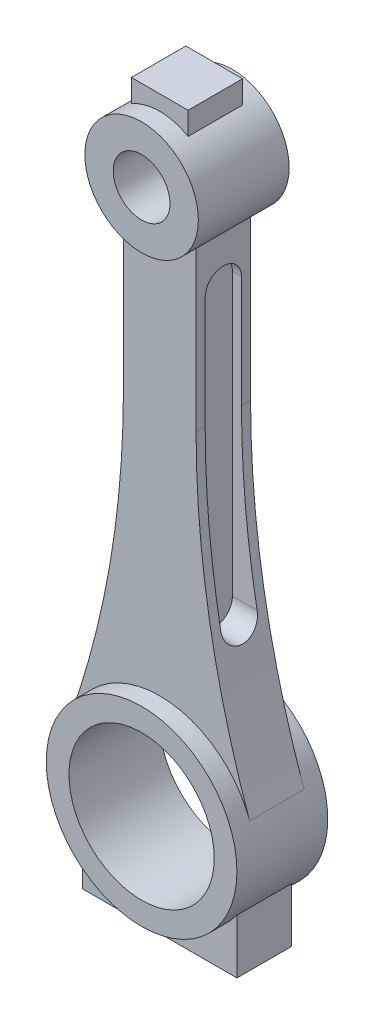
ISO-10303-21;
HEADER;
FILE_DESCRIPTION(('STEP AP214'),'2;1');
FILE_NAME('part.step','',(''),(''),'','','');
FILE_SCHEMA(('AUTOMOTIVE_DESIGN { 1 0 10303 214 1 1 1 1 }'));
ENDSEC;
DATA;
#1=APPLICATION_CONTEXT('core data for automotive mechanical design processes');
#2=APPLICATION_PROTOCOL_DEFINITION('international standard','automotive_design',2000,#1);
#3=PRODUCT_CONTEXT('',#1,'mechanical');
#4=PRODUCT('Part','Part','',(#3));
#5=PRODUCT_RELATED_PRODUCT_CATEGORY('part','',(#4));
#6=PRODUCT_DEFINITION_FORMATION('','',#4);
#7=PRODUCT_DEFINITION_CONTEXT('part definition',#1,'design');
#8=PRODUCT_DEFINITION('design','',#6,#7);
#9=PRODUCT_DEFINITION_SHAPE('','',#8);
#10=(LENGTH_UNIT() NAMED_UNIT(*) SI_UNIT(.MILLI.,.METRE.));
#11=(NAMED_UNIT(*) PLANE_ANGLE_UNIT() SI_UNIT($,.RADIAN.));
#12=(NAMED_UNIT(*) SI_UNIT($,.STERADIAN.) SOLID_ANGLE_UNIT());
#13=UNCERTAINTY_MEASURE_WITH_UNIT(LENGTH_MEASURE(1.E-05),#10,'distance_accuracy_value','');
#14=(GEOMETRIC_REPRESENTATION_CONTEXT(3) GLOBAL_UNCERTAINTY_ASSIGNED_CONTEXT((#13)) GLOBAL_UNIT_ASSIGNED_CONTEXT((#10,
#11,#12)) REPRESENTATION_CONTEXT('',''));
#15=CARTESIAN_POINT('',(0.,0.,0.));
#16=DIRECTION('',(0.,0.,1.));
#17=DIRECTION('',(1.,0.,0.));
#18=AXIS2_PLACEMENT_3D('',#15,#16,#17);
#19=CARTESIAN_POINT('',(212.132819979024,75.3953136438508,6.));
#20=DIRECTION('',(0.,0.,-1.));
#21=DIRECTION('',(-1.,0.,0.));
#22=AXIS2_PLACEMENT_3D('',#19,#20,#21);
#23=CYLINDRICAL_SURFACE('',#22,204.132819979024);
#24=CARTESIAN_POINT('',(11.4544735884215,38.,-4.00000000000001));
#25=CARTESIAN_POINT('',(11.4757515518411,37.885808633556,-4.00000967356236));
#26=CARTESIAN_POINT('',(11.4971278489319,37.7716411229783,-3.9951101211208));
#27=CARTESIAN_POINT('',(11.5399210356049,37.544152772884,-3.97557755361704));
#28=CARTESIAN_POINT('',(11.5613379239584,37.4308319082382,-3.9609448286138));
#29=CARTESIAN_POINT('',(11.6040518019029,37.2058589467753,-3.92203609087538));
#30=CARTESIAN_POINT('',(11.6253488219802,37.0942064124742,-3.89776265395078));
#31=CARTESIAN_POINT('',(11.6676599337569,36.8733657612217,-3.83975872762631));
#32=CARTESIAN_POINT('',(11.6886740293759,36.7641776101132,-3.80602836938937));
#33=CARTESIAN_POINT('',(11.7510730473326,36.4413470108117,-3.69089420326938));
#34=CARTESIAN_POINT('',(11.7918289081029,36.2323636826891,-3.59553432969808));
#35=CARTESIAN_POINT('',(11.8702126062763,35.833491871712,-3.37027556179514));
#36=CARTESIAN_POINT('',(11.9078413597511,35.643597793309,-3.24038682968163));
#37=CARTESIAN_POINT('',(11.9784728244352,35.2894796680367,-2.950436910244));
#38=CARTESIAN_POINT('',(12.0115036519544,35.1250988255321,-2.79057453802655));
#39=CARTESIAN_POINT('',(12.0720036427705,34.8256035029567,-2.44449926104124));
#40=CARTESIAN_POINT('',(12.0994724370193,34.6904909648341,-2.25828460915734));
#41=CARTESIAN_POINT('',(12.1473413477104,34.4559602912754,-1.86832249559897));
#42=CARTESIAN_POINT('',(12.1678582991115,34.3559510460777,-1.66494499104501));
#43=CARTESIAN_POINT('',(12.201667760202,34.1915558050774,-1.24372237948288));
#44=CARTESIAN_POINT('',(12.2149615713728,34.1271633917176,-1.02587988675161));
#45=CARTESIAN_POINT('',(12.2336033492388,34.0369591960168,-0.586274812122711));
#46=CARTESIAN_POINT('',(12.2390950212482,34.0104496060439,-0.36466133556186));
#47=CARTESIAN_POINT('',(12.2423732155318,33.9946184843633,0.0799443502249366));
#48=CARTESIAN_POINT('',(12.2401601145853,34.0052951341723,0.302936491499029));
#49=CARTESIAN_POINT('',(12.2281765408432,34.0632127244266,0.74178192582431));
#50=CARTESIAN_POINT('',(12.2184766498272,34.1101121767817,0.957682365575699));
#51=CARTESIAN_POINT('',(12.1919895794175,34.2385791029979,1.37844153266758));
#52=CARTESIAN_POINT('',(12.1752023313576,34.3201469127454,1.58330015300714));
#53=CARTESIAN_POINT('',(12.1350793834177,34.5159552856904,1.977397761575));
#54=CARTESIAN_POINT('',(12.1117098081663,34.6303649264095,2.16654921549122));
#55=CARTESIAN_POINT('',(12.0593260749272,34.8882465100265,2.52297125984127));
#56=CARTESIAN_POINT('',(12.0303117725959,35.0317191961119,2.69024129055298));
#57=CARTESIAN_POINT('',(11.9671383735568,35.3461665633751,3.00114206510913));
#58=CARTESIAN_POINT('',(11.9329025496515,35.5175545383741,3.14433904981938));
#59=CARTESIAN_POINT('',(11.8607975408037,35.8812712267655,3.40006280722764));
#60=CARTESIAN_POINT('',(11.8229268395297,36.0736086840292,3.51257670427655));
#61=CARTESIAN_POINT('',(11.744011046999,36.4777513253325,3.70593438635491));
#62=CARTESIAN_POINT('',(11.7029182624971,36.6898643551292,3.78611370956407));
#63=CARTESIAN_POINT('',(11.6195357198389,37.1241795414682,3.90944320644274));
#64=CARTESIAN_POINT('',(11.5772477716992,37.3463667203578,3.95264656840454));
#65=CARTESIAN_POINT('',(11.5215540274852,37.6417241762258,3.98457340087694));
#66=CARTESIAN_POINT('',(11.5080944382149,37.7133147532121,3.99036111817268));
#67=CARTESIAN_POINT('',(11.4812368188341,37.8565916807734,3.99806924003837));
#68=CARTESIAN_POINT('',(11.467838723541,37.9282776734255,3.99999606757804));
#69=CARTESIAN_POINT('',(11.4544735884214,38.,3.99999999999999));
#70=B_SPLINE_CURVE_WITH_KNOTS('',3,(#24,#25,#26,#27,#28,#29,#30,#31,#32,#33,#34,#35,#36,#37,#38,
#39,#40,#41,#42,#43,#44,#45,#46,#47,#48,#49,#50,#51,#52,#53,#54,#55,#56,#57,#58,#59,#60,#61,#62,
#63,#64,#65,#66,#67,#68,#69),.UNSPECIFIED.,.F.,.F.,(4,2,2,2,2,2,2,2,2,2,2,2,2,2,2,2,2,2,2,2,2,2,
4),(0.,0.348357600629768,0.696704820295746,1.044959030908,1.39320841164154,2.0894785742732,
2.78554404346983,3.47714614167072,4.16879411353829,4.84816302804555,5.52740949173435,
6.19397531687088,6.86050854603355,7.52083364695974,8.18116514562693,8.84495910470897,
9.508770040179,10.1834922182609,10.8584970981523,11.546741507572,12.2339942357505,
12.4531452672714,12.6719314158043),.UNSPECIFIED.);
#71=CARTESIAN_POINT('',(11.4544735884215,38.,-4.00000000000001));
#72=VERTEX_POINT('',#71);
#73=CARTESIAN_POINT('',(11.4544735884215,38.,3.99999999999999));
#74=VERTEX_POINT('',#73);
#75=EDGE_CURVE('E401',#72,#74,#70,.T.);
#76=ORIENTED_EDGE('',*,*,#75,.T.);
#77=CARTESIAN_POINT('',(212.132819979024,75.3953136438508,3.99999999999999));
#78=DIRECTION('',(0.,0.,-1.));
#79=DIRECTION('',(0.,1.,0.));
#80=AXIS2_PLACEMENT_3D('',#77,#78,#79);
#81=CIRCLE('',#80,204.132819979024);
#82=CARTESIAN_POINT('',(8.00000000000001,75.3953136438507,4.));
#83=VERTEX_POINT('',#82);
#84=EDGE_CURVE('E253',#74,#83,#81,.T.);
#85=ORIENTED_EDGE('',*,*,#84,.T.);
#86=DIRECTION('',(0.,0.,-1.));
#87=VECTOR('',#86,1.);
#88=CARTESIAN_POINT('',(8.00000000000001,75.3953136438507,6.));
#89=LINE('',#88,#87);
#90=CARTESIAN_POINT('',(8.00000000000001,75.3953136438507,6.));
#91=VERTEX_POINT('',#90);
#92=EDGE_CURVE('E377',#91,#83,#89,.T.);
#93=ORIENTED_EDGE('',*,*,#92,.F.);
#94=CARTESIAN_POINT('',(212.132819979024,75.3953136438508,6.));
#95=DIRECTION('',(0.,0.,1.));
#96=DIRECTION('',(1.,0.,0.));
#97=AXIS2_PLACEMENT_3D('',#94,#95,#96);
#98=CIRCLE('',#97,204.132819979024);
#99=CARTESIAN_POINT('',(19.7873824881444,7.03274443356763,6.));
#100=VERTEX_POINT('',#99);
#101=EDGE_CURVE('E334',#91,#100,#98,.T.);
#102=ORIENTED_EDGE('',*,*,#101,.T.);
#103=DIRECTION('',(0.,0.,-1.));
#104=VECTOR('',#103,1.);
#105=CARTESIAN_POINT('',(19.7873824881444,7.03274443356765,6.));
#106=LINE('',#105,#104);
#107=CARTESIAN_POINT('',(19.7873824881444,7.03274443356765,-6.));
#108=VERTEX_POINT('',#107);
#109=EDGE_CURVE('E380',#100,#108,#106,.T.);
#110=ORIENTED_EDGE('',*,*,#109,.T.);
#111=CARTESIAN_POINT('',(212.132819979024,75.3953136438508,-6.));
#112=DIRECTION('',(0.,0.,1.));
#113=DIRECTION('',(1.,0.,0.));
#114=AXIS2_PLACEMENT_3D('',#111,#112,#113);
#115=CIRCLE('',#114,204.132819979024);
#116=CARTESIAN_POINT('',(8.00000000000001,75.3953136438507,-6.));
#117=VERTEX_POINT('',#116);
#118=EDGE_CURVE('E352',#117,#108,#115,.T.);
#119=ORIENTED_EDGE('',*,*,#118,.F.);
#120=CARTESIAN_POINT('',(8.00000000000001,75.3953136438507,-4.));
#121=VERTEX_POINT('',#120);
#122=EDGE_CURVE('E376',#121,#117,#89,.T.);
#123=ORIENTED_EDGE('',*,*,#122,.F.);
#124=CARTESIAN_POINT('',(212.132819979024,75.3953136438508,-4.00000000000001));
#125=DIRECTION('',(0.,0.,1.));
#126=DIRECTION('',(0.,-1.,0.));
#127=AXIS2_PLACEMENT_3D('',#124,#125,#126);
#128=CIRCLE('',#127,204.132819979024);
#129=EDGE_CURVE('E59',#121,#72,#128,.T.);
#130=ORIENTED_EDGE('',*,*,#129,.T.);
#131=EDGE_LOOP('',(#76,#85,#93,#102,#110,#119,#123,#130));
#132=FACE_BOUND('',#131,.T.);
#133=ADVANCED_FACE('F36',(#132),#23,.F.);
#134=CARTESIAN_POINT('',(8.00000000000003,0.,6.));
#135=DIRECTION('',(-1.,0.,0.));
#136=DIRECTION('',(0.,-1.,0.));
#137=AXIS2_PLACEMENT_3D('',#134,#135,#136);
#138=PLANE('',#137);
#139=DIRECTION('',(0.,-1.,0.));
#140=VECTOR('',#139,1.);
#141=CARTESIAN_POINT('',(8.00000000000003,0.,3.99999999999999));
#142=LINE('',#141,#140);
#143=CARTESIAN_POINT('',(8.00000000000001,100.,4.));
#144=VERTEX_POINT('',#143);
#145=EDGE_CURVE('E399',#144,#83,#142,.T.);
#146=ORIENTED_EDGE('',*,*,#145,.F.);
#147=CARTESIAN_POINT('',(8.,100.,0.));
#148=DIRECTION('',(-1.,0.,0.));
#149=DIRECTION('',(0.,-1.,0.));
#150=AXIS2_PLACEMENT_3D('',#147,#148,#149);
#151=CIRCLE('',#150,4.);
#152=CARTESIAN_POINT('',(8.00000000000001,100.,-4.));
#153=VERTEX_POINT('',#152);
#154=EDGE_CURVE('E397',#153,#144,#151,.F.);
#155=ORIENTED_EDGE('',*,*,#154,.F.);
#156=DIRECTION('',(0.,1.,0.));
#157=VECTOR('',#156,1.);
#158=CARTESIAN_POINT('',(8.00000000000003,0.,-4.00000000000001));
#159=LINE('',#158,#157);
#160=EDGE_CURVE('E391',#121,#153,#159,.T.);
#161=ORIENTED_EDGE('',*,*,#160,.F.);
#162=ORIENTED_EDGE('',*,*,#122,.T.);
#163=DIRECTION('',(0.,1.,0.));
#164=VECTOR('',#163,1.);
#165=CARTESIAN_POINT('',(8.00000000000003,0.,-6.));
#166=LINE('',#165,#164);
#167=CARTESIAN_POINT('',(8.,110.395313643851,-6.));
#168=VERTEX_POINT('',#167);
#169=EDGE_CURVE('E355',#117,#168,#166,.T.);
#170=ORIENTED_EDGE('',*,*,#169,.T.);
#171=DIRECTION('',(0.,0.,-1.));
#172=VECTOR('',#171,1.);
#173=CARTESIAN_POINT('',(8.,110.395313643851,6.));
#174=LINE('',#173,#172);
#175=CARTESIAN_POINT('',(8.,110.395313643851,6.));
#176=VERTEX_POINT('',#175);
#177=EDGE_CURVE('E374',#176,#168,#174,.T.);
#178=ORIENTED_EDGE('',*,*,#177,.F.);
#179=DIRECTION('',(0.,1.,0.));
#180=VECTOR('',#179,1.);
#181=CARTESIAN_POINT('',(8.00000000000003,0.,6.));
#182=LINE('',#181,#180);
#183=EDGE_CURVE('E338',#91,#176,#182,.T.);
#184=ORIENTED_EDGE('',*,*,#183,.F.);
#185=ORIENTED_EDGE('',*,*,#92,.T.);
#186=EDGE_LOOP('',(#146,#155,#161,#162,#170,#178,#184,#185));
#187=FACE_BOUND('',#186,.T.);
#188=ADVANCED_FACE('F526',(#187),#138,.F.);
#189=CARTESIAN_POINT('',(0.,120.,10.));
#190=DIRECTION('',(0.,0.,-1.));
#191=DIRECTION('',(-1.,0.,0.));
#192=AXIS2_PLACEMENT_3D('',#189,#190,#191);
#193=CYLINDRICAL_SURFACE('',#192,6.25);
#194=CARTESIAN_POINT('',(0.,120.,10.));
#195=DIRECTION('',(0.,0.,1.));
#196=DIRECTION('',(1.,0.,0.));
#197=AXIS2_PLACEMENT_3D('',#194,#195,#196);
#198=CIRCLE('',#197,6.25);
#199=CARTESIAN_POINT('',(6.25,120.,10.));
#200=VERTEX_POINT('',#199);
#201=EDGE_CURVE('E384',#200,#200,#198,.T.);
#202=ORIENTED_EDGE('',*,*,#201,.T.);
#203=EDGE_LOOP('',(#202));
#204=FACE_BOUND('',#203,.T.);
#205=CARTESIAN_POINT('',(0.,120.,-10.));
#206=DIRECTION('',(0.,0.,1.));
#207=DIRECTION('',(1.,0.,0.));
#208=AXIS2_PLACEMENT_3D('',#205,#206,#207);
#209=CIRCLE('',#208,6.25);
#210=CARTESIAN_POINT('',(6.25,120.,-10.));
#211=VERTEX_POINT('',#210);
#212=EDGE_CURVE('E383',#211,#211,#209,.T.);
#213=ORIENTED_EDGE('',*,*,#212,.F.);
#214=EDGE_LOOP('',(#213));
#215=FACE_BOUND('',#214,.T.);
#216=ADVANCED_FACE('F38',(#204,#215),#193,.F.);
#217=CARTESIAN_POINT('',(0.,120.,10.));
#218=DIRECTION('',(0.,0.,-1.));
#219=DIRECTION('',(-1.,0.,0.));
#220=AXIS2_PLACEMENT_3D('',#217,#218,#219);
#221=CYLINDRICAL_SURFACE('',#220,12.5);
#222=DIRECTION('',(0.,0.,-1.));
#223=VECTOR('',#222,1.);
#224=CARTESIAN_POINT('',(6.25,130.825317547305,6.));
#225=LINE('',#224,#223);
#226=CARTESIAN_POINT('',(6.25,130.825317547305,6.));
#227=VERTEX_POINT('',#226);
#228=CARTESIAN_POINT('',(6.25,130.825317547305,-6.));
#229=VERTEX_POINT('',#228);
#230=EDGE_CURVE('E316',#227,#229,#225,.T.);
#231=ORIENTED_EDGE('',*,*,#230,.F.);
#232=CARTESIAN_POINT('',(0.,120.,6.));
#233=DIRECTION('',(0.,0.,1.));
#234=DIRECTION('',(1.,0.,0.));
#235=AXIS2_PLACEMENT_3D('',#232,#233,#234);
#236=CIRCLE('',#235,12.5);
#237=CARTESIAN_POINT('',(-6.25,130.825317547305,6.));
#238=VERTEX_POINT('',#237);
#239=EDGE_CURVE('E288',#227,#238,#236,.T.);
#240=ORIENTED_EDGE('',*,*,#239,.T.);
#241=DIRECTION('',(0.,0.,-1.));
#242=VECTOR('',#241,1.);
#243=CARTESIAN_POINT('',(-6.25,130.825317547305,6.));
#244=LINE('',#243,#242);
#245=CARTESIAN_POINT('',(-6.25,130.825317547305,-6.));
#246=VERTEX_POINT('',#245);
#247=EDGE_CURVE('E300',#238,#246,#244,.T.);
#248=ORIENTED_EDGE('',*,*,#247,.T.);
#249=CARTESIAN_POINT('',(0.,120.,-6.));
#250=DIRECTION('',(0.,0.,1.));
#251=DIRECTION('',(1.,0.,0.));
#252=AXIS2_PLACEMENT_3D('',#249,#250,#251);
#253=CIRCLE('',#252,12.5);
#254=EDGE_CURVE('E287',#229,#246,#253,.T.);
#255=ORIENTED_EDGE('',*,*,#254,.F.);
#256=EDGE_LOOP('',(#231,#240,#248,#255));
#257=FACE_BOUND('',#256,.T.);
#258=DIRECTION('',(0.,0.,-1.));
#259=VECTOR('',#258,1.);
#260=CARTESIAN_POINT('',(-7.99999999999999,110.395313643851,6.));
#261=LINE('',#260,#259);
#262=CARTESIAN_POINT('',(-7.99999999999999,110.395313643851,6.));
#263=VERTEX_POINT('',#262);
#264=CARTESIAN_POINT('',(-7.99999999999999,110.395313643851,-6.));
#265=VERTEX_POINT('',#264);
#266=EDGE_CURVE('E371',#263,#265,#261,.T.);
#267=ORIENTED_EDGE('',*,*,#266,.F.);
#268=CARTESIAN_POINT('',(0.,120.,6.));
#269=DIRECTION('',(0.,0.,1.));
#270=DIRECTION('',(1.,0.,0.));
#271=AXIS2_PLACEMENT_3D('',#268,#269,#270);
#272=CIRCLE('',#271,12.5);
#273=EDGE_CURVE('E341',#263,#176,#272,.T.);
#274=ORIENTED_EDGE('',*,*,#273,.T.);
#275=ORIENTED_EDGE('',*,*,#177,.T.);
#276=CARTESIAN_POINT('',(0.,120.,-6.));
#277=DIRECTION('',(0.,0.,1.));
#278=DIRECTION('',(1.,0.,0.));
#279=AXIS2_PLACEMENT_3D('',#276,#277,#278);
#280=CIRCLE('',#279,12.5);
#281=EDGE_CURVE('E358',#265,#168,#280,.T.);
#282=ORIENTED_EDGE('',*,*,#281,.F.);
#283=EDGE_LOOP('',(#267,#274,#275,#282));
#284=FACE_BOUND('',#283,.T.);
#285=CARTESIAN_POINT('',(0.,120.,10.));
#286=DIRECTION('',(0.,0.,1.));
#287=DIRECTION('',(1.,0.,0.));
#288=AXIS2_PLACEMENT_3D('',#285,#286,#287);
#289=CIRCLE('',#288,12.5);
#290=CARTESIAN_POINT('',(12.5,120.,10.));
#291=VERTEX_POINT('',#290);
#292=EDGE_CURVE('E387',#291,#291,#289,.T.);
#293=ORIENTED_EDGE('',*,*,#292,.F.);
#294=EDGE_LOOP('',(#293));
#295=FACE_BOUND('',#294,.T.);
#296=CARTESIAN_POINT('',(0.,120.,-10.));
#297=DIRECTION('',(0.,0.,1.));
#298=DIRECTION('',(1.,0.,0.));
#299=AXIS2_PLACEMENT_3D('',#296,#297,#298);
#300=CIRCLE('',#299,12.5);
#301=CARTESIAN_POINT('',(12.5,120.,-10.));
#302=VERTEX_POINT('',#301);
#303=EDGE_CURVE('E388',#302,#302,#300,.T.);
#304=ORIENTED_EDGE('',*,*,#303,.T.);
#305=EDGE_LOOP('',(#304));
#306=FACE_BOUND('',#305,.T.);
#307=ADVANCED_FACE('F557',(#257,#284,#295,#306),#221,.T.);
#308=CARTESIAN_POINT('',(0.,0.,10.));
#309=DIRECTION('',(0.,0.,1.));
#310=DIRECTION('',(1.,0.,0.));
#311=AXIS2_PLACEMENT_3D('',#308,#309,#310);
#312=PLANE('',#311);
#313=ORIENTED_EDGE('',*,*,#201,.F.);
#314=EDGE_LOOP('',(#313));
#315=FACE_BOUND('',#314,.T.);
#316=ORIENTED_EDGE('',*,*,#292,.T.);
#317=EDGE_LOOP('',(#316));
#318=FACE_BOUND('',#317,.T.);
#319=ADVANCED_FACE('F760',(#315,#318),#312,.T.);
#320=CARTESIAN_POINT('',(0.,0.,-10.));
#321=DIRECTION('',(0.,0.,1.));
#322=DIRECTION('',(1.,0.,0.));
#323=AXIS2_PLACEMENT_3D('',#320,#321,#322);
#324=PLANE('',#323);
#325=ORIENTED_EDGE('',*,*,#212,.T.);
#326=EDGE_LOOP('',(#325));
#327=FACE_BOUND('',#326,.T.);
#328=ORIENTED_EDGE('',*,*,#303,.F.);
#329=EDGE_LOOP('',(#328));
#330=FACE_BOUND('',#329,.T.);
#331=ADVANCED_FACE('F608',(#327,#330),#324,.F.);
#332=CARTESIAN_POINT('',(-7.99999999999999,0.,6.));
#333=DIRECTION('',(-1.,0.,0.));
#334=DIRECTION('',(0.,0.,1.));
#335=AXIS2_PLACEMENT_3D('',#332,#333,#334);
#336=PLANE('',#335);
#337=DIRECTION('',(0.,-1.,0.));
#338=VECTOR('',#337,1.);
#339=CARTESIAN_POINT('',(-7.99999999999999,0.,-4.00000000000001));
#340=LINE('',#339,#338);
#341=CARTESIAN_POINT('',(-7.99999999999999,100.,-4.));
#342=VERTEX_POINT('',#341);
#343=CARTESIAN_POINT('',(-7.99999999999995,75.3953136438507,-4.00000000000001));
#344=VERTEX_POINT('',#343);
#345=EDGE_CURVE('E230',#342,#344,#340,.T.);
#346=ORIENTED_EDGE('',*,*,#345,.F.);
#347=CARTESIAN_POINT('',(-7.99999999999999,100.,0.));
#348=DIRECTION('',(-1.,0.,0.));
#349=DIRECTION('',(0.,0.,1.));
#350=AXIS2_PLACEMENT_3D('',#347,#348,#349);
#351=CIRCLE('',#350,4.);
#352=CARTESIAN_POINT('',(-7.99999999999999,100.,4.));
#353=VERTEX_POINT('',#352);
#354=EDGE_CURVE('E11',#353,#342,#351,.T.);
#355=ORIENTED_EDGE('',*,*,#354,.F.);
#356=DIRECTION('',(0.,1.,0.));
#357=VECTOR('',#356,1.);
#358=CARTESIAN_POINT('',(-7.99999999999999,0.,3.99999999999999));
#359=LINE('',#358,#357);
#360=CARTESIAN_POINT('',(-7.99999999999995,75.3953136438507,3.99999999999999));
#361=VERTEX_POINT('',#360);
#362=EDGE_CURVE('E207',#361,#353,#359,.T.);
#363=ORIENTED_EDGE('',*,*,#362,.F.);
#364=DIRECTION('',(0.,0.,-1.));
#365=VECTOR('',#364,1.);
#366=CARTESIAN_POINT('',(-7.99999999999999,75.3953136438507,6.));
#367=LINE('',#366,#365);
#368=CARTESIAN_POINT('',(-7.99999999999999,75.3953136438507,6.));
#369=VERTEX_POINT('',#368);
#370=EDGE_CURVE('E368',#369,#361,#367,.T.);
#371=ORIENTED_EDGE('',*,*,#370,.F.);
#372=DIRECTION('',(0.,1.,0.));
#373=VECTOR('',#372,1.);
#374=CARTESIAN_POINT('',(-7.99999999999999,0.,6.));
#375=LINE('',#374,#373);
#376=EDGE_CURVE('E343',#369,#263,#375,.T.);
#377=ORIENTED_EDGE('',*,*,#376,.T.);
#378=ORIENTED_EDGE('',*,*,#266,.T.);
#379=DIRECTION('',(0.,1.,0.));
#380=VECTOR('',#379,1.);
#381=CARTESIAN_POINT('',(-7.99999999999999,0.,-6.));
#382=LINE('',#381,#380);
#383=CARTESIAN_POINT('',(-7.99999999999999,75.3953136438507,-6.));
#384=VERTEX_POINT('',#383);
#385=EDGE_CURVE('E361',#384,#265,#382,.T.);
#386=ORIENTED_EDGE('',*,*,#385,.F.);
#387=EDGE_CURVE('E367',#344,#384,#367,.T.);
#388=ORIENTED_EDGE('',*,*,#387,.F.);
#389=EDGE_LOOP('',(#346,#355,#363,#371,#377,#378,#386,#388));
#390=FACE_BOUND('',#389,.T.);
#391=ADVANCED_FACE('F499',(#390),#336,.T.);
#392=CARTESIAN_POINT('',(-212.132819979024,75.3953136438507,6.));
#393=DIRECTION('',(0.,0.,-1.));
#394=DIRECTION('',(-1.,0.,0.));
#395=AXIS2_PLACEMENT_3D('',#392,#393,#394);
#396=CYLINDRICAL_SURFACE('',#395,204.132819979024);
#397=CARTESIAN_POINT('',(-11.4544735884215,38.,3.99999999999999));
#398=CARTESIAN_POINT('',(-11.4757515518411,37.885808633556,4.00000967356234));
#399=CARTESIAN_POINT('',(-11.4971278489319,37.7716411229783,3.99511012112078));
#400=CARTESIAN_POINT('',(-11.5399210356049,37.544152772884,3.97557755361703));
#401=CARTESIAN_POINT('',(-11.5613379239584,37.4308319082382,3.96094482861378));
#402=CARTESIAN_POINT('',(-11.6040518019029,37.2058589467753,3.92203609087536));
#403=CARTESIAN_POINT('',(-11.6253488219802,37.0942064124742,3.89776265395076));
#404=CARTESIAN_POINT('',(-11.6676599337568,36.8733657612217,3.83975872762629));
#405=CARTESIAN_POINT('',(-11.6886740293759,36.7641776101132,3.80602836938935));
#406=CARTESIAN_POINT('',(-11.7510730473326,36.4413470108117,3.69089420326937));
#407=CARTESIAN_POINT('',(-11.7918289081029,36.2323636826891,3.59553432969806));
#408=CARTESIAN_POINT('',(-11.8702126062763,35.833491871712,3.37027556179512));
#409=CARTESIAN_POINT('',(-11.9078413597511,35.643597793309,3.24038682968162));
#410=CARTESIAN_POINT('',(-11.9784728244352,35.2894796680367,2.95043691024399));
#411=CARTESIAN_POINT('',(-12.0115036519544,35.1250988255321,2.79057453802654));
#412=CARTESIAN_POINT('',(-12.0720036427705,34.8256035029567,2.44449926104122));
#413=CARTESIAN_POINT('',(-12.0994724370193,34.6904909648341,2.25828460915732));
#414=CARTESIAN_POINT('',(-12.1473413477104,34.4559602912754,1.86832249559895));
#415=CARTESIAN_POINT('',(-12.1678582991114,34.3559510460777,1.66494499104499));
#416=CARTESIAN_POINT('',(-12.201667760202,34.1915558050774,1.24372237948286));
#417=CARTESIAN_POINT('',(-12.2149615713728,34.1271633917176,1.02587988675159));
#418=CARTESIAN_POINT('',(-12.2336033492387,34.0369591960168,0.586274812122691));
#419=CARTESIAN_POINT('',(-12.2390950212481,34.0104496060439,0.36466133556184));
#420=CARTESIAN_POINT('',(-12.2423732155318,33.9946184843633,-0.079944350224957));
#421=CARTESIAN_POINT('',(-12.2401601145852,34.0052951341723,-0.30293649149905));
#422=CARTESIAN_POINT('',(-12.2281765408432,34.0632127244266,-0.74178192582433));
#423=CARTESIAN_POINT('',(-12.2184766498271,34.1101121767817,-0.957682365575717));
#424=CARTESIAN_POINT('',(-12.1919895794175,34.2385791029979,-1.3784415326676));
#425=CARTESIAN_POINT('',(-12.1752023313576,34.3201469127454,-1.58330015300716));
#426=CARTESIAN_POINT('',(-12.1350793834177,34.5159552856904,-1.97739776157502));
#427=CARTESIAN_POINT('',(-12.1117098081663,34.6303649264095,-2.16654921549124));
#428=CARTESIAN_POINT('',(-12.0593260749272,34.8882465100265,-2.52297125984129));
#429=CARTESIAN_POINT('',(-12.0303117725958,35.0317191961119,-2.690241290553));
#430=CARTESIAN_POINT('',(-11.9671383735568,35.3461665633751,-3.00114206510916));
#431=CARTESIAN_POINT('',(-11.9329025496514,35.5175545383741,-3.1443390498194));
#432=CARTESIAN_POINT('',(-11.8607975408037,35.8812712267655,-3.40006280722766));
#433=CARTESIAN_POINT('',(-11.8229268395298,36.0736086840292,-3.51257670427658));
#434=CARTESIAN_POINT('',(-11.744011046999,36.4777513253325,-3.70593438635493));
#435=CARTESIAN_POINT('',(-11.702918262497,36.6898643551292,-3.78611370956409));
#436=CARTESIAN_POINT('',(-11.6195357198389,37.1241795414682,-3.90944320644275));
#437=CARTESIAN_POINT('',(-11.5772477716992,37.3463667203578,-3.95264656840456));
#438=CARTESIAN_POINT('',(-11.5215540274852,37.6417241762258,-3.98457340087696));
#439=CARTESIAN_POINT('',(-11.5080944382148,37.7133147532121,-3.9903611181727));
#440=CARTESIAN_POINT('',(-11.4812368188341,37.8565916807734,-3.99806924003838));
#441=CARTESIAN_POINT('',(-11.4678387235409,37.9282776734255,-3.99999606757806));
#442=CARTESIAN_POINT('',(-11.4544735884215,38.,-4.00000000000001));
#443=B_SPLINE_CURVE_WITH_KNOTS('',3,(#397,#398,#399,#400,#401,#402,#403,#404,#405,#406,#407,
#408,#409,#410,#411,#412,#413,#414,#415,#416,#417,#418,#419,#420,#421,#422,#423,#424,#425,#426,
#427,#428,#429,#430,#431,#432,#433,#434,#435,#436,#437,#438,#439,#440,#441,#442),.UNSPECIFIED.,
.F.,.F.,(4,2,2,2,2,2,2,2,2,2,2,2,2,2,2,2,2,2,2,2,2,2,4),(0.,0.348357600629778,0.696704820295753,
1.044959030908,1.39320841164154,2.0894785742732,2.78554404346983,3.47714614167072,
4.1687941135383,4.84816302804555,5.52740949173435,6.19397531687089,6.86050854603355,
7.52083364695974,8.18116514562693,8.84495910470897,9.508770040179,10.1834922182609,
10.8584970981523,11.546741507572,12.2339942357505,12.4531452672714,12.6719314158043),.UNSPECIFIED.);
#444=CARTESIAN_POINT('',(-11.4544735884215,38.,3.99999999999999));
#445=VERTEX_POINT('',#444);
#446=CARTESIAN_POINT('',(-11.4544735884215,38.,-4.00000000000001));
#447=VERTEX_POINT('',#446);
#448=EDGE_CURVE('E501',#445,#447,#443,.T.);
#449=ORIENTED_EDGE('',*,*,#448,.T.);
#450=CARTESIAN_POINT('',(-212.132819979024,75.3953136438507,-4.00000000000001));
#451=DIRECTION('',(0.,0.,-1.));
#452=DIRECTION('',(0.,1.,0.));
#453=AXIS2_PLACEMENT_3D('',#450,#451,#452);
#454=CIRCLE('',#453,204.132819979024);
#455=EDGE_CURVE('E44',#447,#344,#454,.F.);
#456=ORIENTED_EDGE('',*,*,#455,.T.);
#457=ORIENTED_EDGE('',*,*,#387,.T.);
#458=CARTESIAN_POINT('',(-212.132819979024,75.3953136438507,-6.));
#459=DIRECTION('',(0.,0.,1.));
#460=DIRECTION('',(1.,0.,0.));
#461=AXIS2_PLACEMENT_3D('',#458,#459,#460);
#462=CIRCLE('',#461,204.132819979024);
#463=CARTESIAN_POINT('',(-19.7873824881444,7.03274443356764,-6.));
#464=VERTEX_POINT('',#463);
#465=EDGE_CURVE('E335',#384,#464,#462,.F.);
#466=ORIENTED_EDGE('',*,*,#465,.T.);
#467=DIRECTION('',(0.,0.,-1.));
#468=VECTOR('',#467,1.);
#469=CARTESIAN_POINT('',(-19.7873824881444,7.03274443356764,6.));
#470=LINE('',#469,#468);
#471=CARTESIAN_POINT('',(-19.7873824881444,7.03274443356764,6.));
#472=VERTEX_POINT('',#471);
#473=EDGE_CURVE('E349',#472,#464,#470,.T.);
#474=ORIENTED_EDGE('',*,*,#473,.F.);
#475=CARTESIAN_POINT('',(-212.132819979024,75.3953136438507,6.));
#476=DIRECTION('',(0.,0.,1.));
#477=DIRECTION('',(1.,0.,0.));
#478=AXIS2_PLACEMENT_3D('',#475,#476,#477);
#479=CIRCLE('',#478,204.132819979024);
#480=EDGE_CURVE('E346',#369,#472,#479,.F.);
#481=ORIENTED_EDGE('',*,*,#480,.F.);
#482=ORIENTED_EDGE('',*,*,#370,.T.);
#483=CARTESIAN_POINT('',(-212.132819979024,75.3953136438507,3.99999999999999));
#484=DIRECTION('',(0.,0.,1.));
#485=DIRECTION('',(0.,-1.,0.));
#486=AXIS2_PLACEMENT_3D('',#483,#484,#485);
#487=CIRCLE('',#486,204.132819979024);
#488=EDGE_CURVE('E410',#361,#445,#487,.F.);
#489=ORIENTED_EDGE('',*,*,#488,.T.);
#490=EDGE_LOOP('',(#449,#456,#457,#466,#474,#481,#482,#489));
#491=FACE_BOUND('',#490,.T.);
#492=ADVANCED_FACE('F491',(#491),#396,.F.);
#493=CARTESIAN_POINT('',(0.,0.,6.));
#494=DIRECTION('',(0.,0.,1.));
#495=DIRECTION('',(1.,0.,0.));
#496=AXIS2_PLACEMENT_3D('',#493,#494,#495);
#497=PLANE('',#496);
#498=CARTESIAN_POINT('',(0.,0.,6.));
#499=DIRECTION('',(0.,0.,1.));
#500=DIRECTION('',(1.,0.,0.));
#501=AXIS2_PLACEMENT_3D('',#498,#499,#500);
#502=CIRCLE('',#501,21.);
#503=EDGE_CURVE('E332',#100,#472,#502,.T.);
#504=ORIENTED_EDGE('',*,*,#503,.F.);
#505=ORIENTED_EDGE('',*,*,#101,.F.);
#506=ORIENTED_EDGE('',*,*,#183,.T.);
#507=ORIENTED_EDGE('',*,*,#273,.F.);
#508=ORIENTED_EDGE('',*,*,#376,.F.);
#509=ORIENTED_EDGE('',*,*,#480,.T.);
#510=EDGE_LOOP('',(#504,#505,#506,#507,#508,#509));
#511=FACE_BOUND('',#510,.T.);
#512=ADVANCED_FACE('F488',(#511),#497,.T.);
#513=CARTESIAN_POINT('',(0.,0.,-6.));
#514=DIRECTION('',(0.,0.,1.));
#515=DIRECTION('',(1.,0.,0.));
#516=AXIS2_PLACEMENT_3D('',#513,#514,#515);
#517=PLANE('',#516);
#518=CARTESIAN_POINT('',(0.,0.,-6.));
#519=DIRECTION('',(0.,0.,1.));
#520=DIRECTION('',(1.,0.,0.));
#521=AXIS2_PLACEMENT_3D('',#518,#519,#520);
#522=CIRCLE('',#521,21.);
#523=EDGE_CURVE('E327',#108,#464,#522,.T.);
#524=ORIENTED_EDGE('',*,*,#523,.T.);
#525=ORIENTED_EDGE('',*,*,#465,.F.);
#526=ORIENTED_EDGE('',*,*,#385,.T.);
#527=ORIENTED_EDGE('',*,*,#281,.T.);
#528=ORIENTED_EDGE('',*,*,#169,.F.);
#529=ORIENTED_EDGE('',*,*,#118,.T.);
#530=EDGE_LOOP('',(#524,#525,#526,#527,#528,#529));
#531=FACE_BOUND('',#530,.T.);
#532=ADVANCED_FACE('F486',(#531),#517,.F.);
#533=CARTESIAN_POINT('',(0.,0.,10.));
#534=DIRECTION('',(0.,0.,-1.));
#535=DIRECTION('',(-1.,0.,0.));
#536=AXIS2_PLACEMENT_3D('',#533,#534,#535);
#537=CYLINDRICAL_SURFACE('',#536,16.);
#538=CARTESIAN_POINT('',(0.,0.,10.));
#539=DIRECTION('',(0.,0.,1.));
#540=DIRECTION('',(1.,0.,0.));
#541=AXIS2_PLACEMENT_3D('',#538,#539,#540);
#542=CIRCLE('',#541,16.);
#543=CARTESIAN_POINT('',(16.,0.,10.));
#544=VERTEX_POINT('',#543);
#545=EDGE_CURVE('E320',#544,#544,#542,.T.);
#546=ORIENTED_EDGE('',*,*,#545,.T.);
#547=EDGE_LOOP('',(#546));
#548=FACE_BOUND('',#547,.T.);
#549=CARTESIAN_POINT('',(0.,0.,-10.));
#550=DIRECTION('',(0.,0.,1.));
#551=DIRECTION('',(1.,0.,0.));
#552=AXIS2_PLACEMENT_3D('',#549,#550,#551);
#553=CIRCLE('',#552,16.);
#554=CARTESIAN_POINT('',(16.,0.,-10.));
#555=VERTEX_POINT('',#554);
#556=EDGE_CURVE('E319',#555,#555,#553,.T.);
#557=ORIENTED_EDGE('',*,*,#556,.F.);
#558=EDGE_LOOP('',(#557));
#559=FACE_BOUND('',#558,.T.);
#560=ADVANCED_FACE('F482',(#548,#559),#537,.F.);
#561=CARTESIAN_POINT('',(0.,0.,10.));
#562=DIRECTION('',(0.,0.,-1.));
#563=DIRECTION('',(-1.,0.,0.));
#564=AXIS2_PLACEMENT_3D('',#561,#562,#563);
#565=CYLINDRICAL_SURFACE('',#564,21.);
#566=DIRECTION('',(0.,0.,-1.));
#567=VECTOR('',#566,1.);
#568=CARTESIAN_POINT('',(-17.,-12.328828005938,6.));
#569=LINE('',#568,#567);
#570=CARTESIAN_POINT('',(-17.,-12.328828005938,6.));
#571=VERTEX_POINT('',#570);
#572=CARTESIAN_POINT('',(-17.,-12.328828005938,-6.));
#573=VERTEX_POINT('',#572);
#574=EDGE_CURVE('E284',#571,#573,#569,.T.);
#575=ORIENTED_EDGE('',*,*,#574,.F.);
#576=CARTESIAN_POINT('',(0.,0.,6.));
#577=DIRECTION('',(0.,0.,1.));
#578=DIRECTION('',(1.,0.,0.));
#579=AXIS2_PLACEMENT_3D('',#576,#577,#578);
#580=CIRCLE('',#579,21.);
#581=CARTESIAN_POINT('',(17.,-12.3288280059379,6.));
#582=VERTEX_POINT('',#581);
#583=EDGE_CURVE('E257',#571,#582,#580,.T.);
#584=ORIENTED_EDGE('',*,*,#583,.T.);
#585=DIRECTION('',(0.,0.,-1.));
#586=VECTOR('',#585,1.);
#587=CARTESIAN_POINT('',(17.,-12.328828005938,6.));
#588=LINE('',#587,#586);
#589=CARTESIAN_POINT('',(17.,-12.328828005938,-6.));
#590=VERTEX_POINT('',#589);
#591=EDGE_CURVE('E268',#582,#590,#588,.T.);
#592=ORIENTED_EDGE('',*,*,#591,.T.);
#593=CARTESIAN_POINT('',(0.,0.,-6.));
#594=DIRECTION('',(0.,0.,1.));
#595=DIRECTION('',(1.,0.,0.));
#596=AXIS2_PLACEMENT_3D('',#593,#594,#595);
#597=CIRCLE('',#596,21.);
#598=EDGE_CURVE('E256',#573,#590,#597,.T.);
#599=ORIENTED_EDGE('',*,*,#598,.F.);
#600=EDGE_LOOP('',(#575,#584,#592,#599));
#601=FACE_BOUND('',#600,.T.);
#602=ORIENTED_EDGE('',*,*,#503,.T.);
#603=ORIENTED_EDGE('',*,*,#473,.T.);
#604=ORIENTED_EDGE('',*,*,#523,.F.);
#605=ORIENTED_EDGE('',*,*,#109,.F.);
#606=EDGE_LOOP('',(#602,#603,#604,#605));
#607=FACE_BOUND('',#606,.T.);
#608=CARTESIAN_POINT('',(0.,0.,10.));
#609=DIRECTION('',(0.,0.,1.));
#610=DIRECTION('',(1.,0.,0.));
#611=AXIS2_PLACEMENT_3D('',#608,#609,#610);
#612=CIRCLE('',#611,21.);
#613=CARTESIAN_POINT('',(21.,0.,10.));
#614=VERTEX_POINT('',#613);
#615=EDGE_CURVE('E323',#614,#614,#612,.T.);
#616=ORIENTED_EDGE('',*,*,#615,.F.);
#617=EDGE_LOOP('',(#616));
#618=FACE_BOUND('',#617,.T.);
#619=CARTESIAN_POINT('',(0.,0.,-10.));
#620=DIRECTION('',(0.,0.,1.));
#621=DIRECTION('',(1.,0.,0.));
#622=AXIS2_PLACEMENT_3D('',#619,#620,#621);
#623=CIRCLE('',#622,21.);
#624=CARTESIAN_POINT('',(21.,0.,-10.));
#625=VERTEX_POINT('',#624);
#626=EDGE_CURVE('E324',#625,#625,#623,.T.);
#627=ORIENTED_EDGE('',*,*,#626,.T.);
#628=EDGE_LOOP('',(#627));
#629=FACE_BOUND('',#628,.T.);
#630=ADVANCED_FACE('F475',(#601,#607,#618,#629),#565,.T.);
#631=CARTESIAN_POINT('',(0.,0.,10.));
#632=DIRECTION('',(0.,0.,1.));
#633=DIRECTION('',(1.,0.,0.));
#634=AXIS2_PLACEMENT_3D('',#631,#632,#633);
#635=PLANE('',#634);
#636=ORIENTED_EDGE('',*,*,#545,.F.);
#637=EDGE_LOOP('',(#636));
#638=FACE_BOUND('',#637,.T.);
#639=ORIENTED_EDGE('',*,*,#615,.T.);
#640=EDGE_LOOP('',(#639));
#641=FACE_BOUND('',#640,.T.);
#642=ADVANCED_FACE('F472',(#638,#641),#635,.T.);
#643=CARTESIAN_POINT('',(0.,0.,-10.));
#644=DIRECTION('',(0.,0.,1.));
#645=DIRECTION('',(1.,0.,0.));
#646=AXIS2_PLACEMENT_3D('',#643,#644,#645);
#647=PLANE('',#646);
#648=ORIENTED_EDGE('',*,*,#556,.T.);
#649=EDGE_LOOP('',(#648));
#650=FACE_BOUND('',#649,.T.);
#651=ORIENTED_EDGE('',*,*,#626,.F.);
#652=EDGE_LOOP('',(#651));
#653=FACE_BOUND('',#652,.T.);
#654=ADVANCED_FACE('F470',(#650,#653),#647,.F.);
#655=CARTESIAN_POINT('',(6.25,0.,6.));
#656=DIRECTION('',(1.,0.,0.));
#657=DIRECTION('',(0.,0.,-1.));
#658=AXIS2_PLACEMENT_3D('',#655,#656,#657);
#659=PLANE('',#658);
#660=DIRECTION('',(0.,-1.,0.));
#661=VECTOR('',#660,1.);
#662=CARTESIAN_POINT('',(6.25,0.,-6.));
#663=LINE('',#662,#661);
#664=CARTESIAN_POINT('',(6.25,135.825317547305,-6.));
#665=VERTEX_POINT('',#664);
#666=EDGE_CURVE('E303',#665,#229,#663,.T.);
#667=ORIENTED_EDGE('',*,*,#666,.F.);
#668=DIRECTION('',(0.,0.,-1.));
#669=VECTOR('',#668,1.);
#670=CARTESIAN_POINT('',(6.25,135.825317547305,6.));
#671=LINE('',#670,#669);
#672=CARTESIAN_POINT('',(6.25,135.825317547305,6.));
#673=VERTEX_POINT('',#672);
#674=EDGE_CURVE('E314',#673,#665,#671,.T.);
#675=ORIENTED_EDGE('',*,*,#674,.F.);
#676=DIRECTION('',(0.,-1.,0.));
#677=VECTOR('',#676,1.);
#678=CARTESIAN_POINT('',(6.25,0.,6.));
#679=LINE('',#678,#677);
#680=EDGE_CURVE('E290',#673,#227,#679,.T.);
#681=ORIENTED_EDGE('',*,*,#680,.T.);
#682=ORIENTED_EDGE('',*,*,#230,.T.);
#683=EDGE_LOOP('',(#667,#675,#681,#682));
#684=FACE_BOUND('',#683,.T.);
#685=ADVANCED_FACE('F466',(#684),#659,.T.);
#686=CARTESIAN_POINT('',(0.,135.825317547305,6.));
#687=DIRECTION('',(0.,1.,0.));
#688=DIRECTION('',(0.,0.,1.));
#689=AXIS2_PLACEMENT_3D('',#686,#687,#688);
#690=PLANE('',#689);
#691=DIRECTION('',(1.,0.,0.));
#692=VECTOR('',#691,1.);
#693=CARTESIAN_POINT('',(0.,135.825317547305,-6.));
#694=LINE('',#693,#692);
#695=CARTESIAN_POINT('',(-6.25,135.825317547305,-6.));
#696=VERTEX_POINT('',#695);
#697=EDGE_CURVE('E306',#696,#665,#694,.T.);
#698=ORIENTED_EDGE('',*,*,#697,.F.);
#699=DIRECTION('',(0.,0.,-1.));
#700=VECTOR('',#699,1.);
#701=CARTESIAN_POINT('',(-6.25,135.825317547305,6.));
#702=LINE('',#701,#700);
#703=CARTESIAN_POINT('',(-6.25,135.825317547305,6.));
#704=VERTEX_POINT('',#703);
#705=EDGE_CURVE('E312',#704,#696,#702,.T.);
#706=ORIENTED_EDGE('',*,*,#705,.F.);
#707=DIRECTION('',(1.,0.,0.));
#708=VECTOR('',#707,1.);
#709=CARTESIAN_POINT('',(0.,135.825317547305,6.));
#710=LINE('',#709,#708);
#711=EDGE_CURVE('E294',#704,#673,#710,.T.);
#712=ORIENTED_EDGE('',*,*,#711,.T.);
#713=ORIENTED_EDGE('',*,*,#674,.T.);
#714=EDGE_LOOP('',(#698,#706,#712,#713));
#715=FACE_BOUND('',#714,.T.);
#716=ADVANCED_FACE('F462',(#715),#690,.T.);
#717=CARTESIAN_POINT('',(-6.25,0.,6.));
#718=DIRECTION('',(1.,0.,0.));
#719=DIRECTION('',(0.,0.,-1.));
#720=AXIS2_PLACEMENT_3D('',#717,#718,#719);
#721=PLANE('',#720);
#722=DIRECTION('',(0.,-1.,0.));
#723=VECTOR('',#722,1.);
#724=CARTESIAN_POINT('',(-6.25,0.,-6.));
#725=LINE('',#724,#723);
#726=EDGE_CURVE('E291',#696,#246,#725,.T.);
#727=ORIENTED_EDGE('',*,*,#726,.T.);
#728=ORIENTED_EDGE('',*,*,#247,.F.);
#729=DIRECTION('',(0.,-1.,0.));
#730=VECTOR('',#729,1.);
#731=CARTESIAN_POINT('',(-6.25,0.,6.));
#732=LINE('',#731,#730);
#733=EDGE_CURVE('E297',#704,#238,#732,.T.);
#734=ORIENTED_EDGE('',*,*,#733,.F.);
#735=ORIENTED_EDGE('',*,*,#705,.T.);
#736=EDGE_LOOP('',(#727,#728,#734,#735));
#737=FACE_BOUND('',#736,.T.);
#738=ADVANCED_FACE('F455',(#737),#721,.F.);
#739=CARTESIAN_POINT('',(0.,0.,6.));
#740=DIRECTION('',(0.,0.,1.));
#741=DIRECTION('',(1.,0.,0.));
#742=AXIS2_PLACEMENT_3D('',#739,#740,#741);
#743=PLANE('',#742);
#744=ORIENTED_EDGE('',*,*,#239,.F.);
#745=ORIENTED_EDGE('',*,*,#680,.F.);
#746=ORIENTED_EDGE('',*,*,#711,.F.);
#747=ORIENTED_EDGE('',*,*,#733,.T.);
#748=EDGE_LOOP('',(#744,#745,#746,#747));
#749=FACE_BOUND('',#748,.T.);
#750=ADVANCED_FACE('F452',(#749),#743,.T.);
#751=CARTESIAN_POINT('',(0.,0.,-6.));
#752=DIRECTION('',(0.,0.,1.));
#753=DIRECTION('',(1.,0.,0.));
#754=AXIS2_PLACEMENT_3D('',#751,#752,#753);
#755=PLANE('',#754);
#756=ORIENTED_EDGE('',*,*,#254,.T.);
#757=ORIENTED_EDGE('',*,*,#726,.F.);
#758=ORIENTED_EDGE('',*,*,#697,.T.);
#759=ORIENTED_EDGE('',*,*,#666,.T.);
#760=EDGE_LOOP('',(#756,#757,#758,#759));
#761=FACE_BOUND('',#760,.T.);
#762=ADVANCED_FACE('F450',(#761),#755,.F.);
#763=CARTESIAN_POINT('',(-17.,0.,6.));
#764=DIRECTION('',(-1.,0.,0.));
#765=DIRECTION('',(0.,0.,1.));
#766=AXIS2_PLACEMENT_3D('',#763,#764,#765);
#767=PLANE('',#766);
#768=DIRECTION('',(0.,1.,0.));
#769=VECTOR('',#768,1.);
#770=CARTESIAN_POINT('',(-17.,0.,-6.));
#771=LINE('',#770,#769);
#772=CARTESIAN_POINT('',(-17.,-24.328828005938,-6.));
#773=VERTEX_POINT('',#772);
#774=EDGE_CURVE('E271',#773,#573,#771,.T.);
#775=ORIENTED_EDGE('',*,*,#774,.F.);
#776=DIRECTION('',(0.,0.,-1.));
#777=VECTOR('',#776,1.);
#778=CARTESIAN_POINT('',(-17.,-24.328828005938,6.));
#779=LINE('',#778,#777);
#780=CARTESIAN_POINT('',(-17.,-24.328828005938,6.));
#781=VERTEX_POINT('',#780);
#782=EDGE_CURVE('E282',#781,#773,#779,.T.);
#783=ORIENTED_EDGE('',*,*,#782,.F.);
#784=DIRECTION('',(0.,1.,0.));
#785=VECTOR('',#784,1.);
#786=CARTESIAN_POINT('',(-17.,0.,6.));
#787=LINE('',#786,#785);
#788=EDGE_CURVE('E259',#781,#571,#787,.T.);
#789=ORIENTED_EDGE('',*,*,#788,.T.);
#790=ORIENTED_EDGE('',*,*,#574,.T.);
#791=EDGE_LOOP('',(#775,#783,#789,#790));
#792=FACE_BOUND('',#791,.T.);
#793=ADVANCED_FACE('F446',(#792),#767,.T.);
#794=CARTESIAN_POINT('',(0.,-24.328828005938,6.));
#795=DIRECTION('',(0.,1.,0.));
#796=DIRECTION('',(-1.,0.,0.));
#797=AXIS2_PLACEMENT_3D('',#794,#795,#796);
#798=PLANE('',#797);
#799=DIRECTION('',(1.,0.,0.));
#800=VECTOR('',#799,1.);
#801=CARTESIAN_POINT('',(0.,-24.328828005938,-6.));
#802=LINE('',#801,#800);
#803=CARTESIAN_POINT('',(17.,-24.328828005938,-6.));
#804=VERTEX_POINT('',#803);
#805=EDGE_CURVE('E274',#773,#804,#802,.T.);
#806=ORIENTED_EDGE('',*,*,#805,.T.);
#807=DIRECTION('',(0.,0.,-1.));
#808=VECTOR('',#807,1.);
#809=CARTESIAN_POINT('',(17.,-24.328828005938,6.));
#810=LINE('',#809,#808);
#811=CARTESIAN_POINT('',(17.,-24.328828005938,6.));
#812=VERTEX_POINT('',#811);
#813=EDGE_CURVE('E279',#812,#804,#810,.T.);
#814=ORIENTED_EDGE('',*,*,#813,.F.);
#815=DIRECTION('',(1.,0.,0.));
#816=VECTOR('',#815,1.);
#817=CARTESIAN_POINT('',(0.,-24.328828005938,6.));
#818=LINE('',#817,#816);
#819=EDGE_CURVE('E263',#781,#812,#818,.T.);
#820=ORIENTED_EDGE('',*,*,#819,.F.);
#821=ORIENTED_EDGE('',*,*,#782,.T.);
#822=EDGE_LOOP('',(#806,#814,#820,#821));
#823=FACE_BOUND('',#822,.T.);
#824=ADVANCED_FACE('F442',(#823),#798,.F.);
#825=CARTESIAN_POINT('',(17.,0.,6.));
#826=DIRECTION('',(-1.,0.,0.));
#827=DIRECTION('',(0.,-1.,0.));
#828=AXIS2_PLACEMENT_3D('',#825,#826,#827);
#829=PLANE('',#828);
#830=DIRECTION('',(0.,1.,0.));
#831=VECTOR('',#830,1.);
#832=CARTESIAN_POINT('',(17.,0.,-6.));
#833=LINE('',#832,#831);
#834=EDGE_CURVE('E260',#804,#590,#833,.T.);
#835=ORIENTED_EDGE('',*,*,#834,.T.);
#836=ORIENTED_EDGE('',*,*,#591,.F.);
#837=DIRECTION('',(0.,1.,0.));
#838=VECTOR('',#837,1.);
#839=CARTESIAN_POINT('',(17.,0.,6.));
#840=LINE('',#839,#838);
#841=EDGE_CURVE('E265',#812,#582,#840,.T.);
#842=ORIENTED_EDGE('',*,*,#841,.F.);
#843=ORIENTED_EDGE('',*,*,#813,.T.);
#844=EDGE_LOOP('',(#835,#836,#842,#843));
#845=FACE_BOUND('',#844,.T.);
#846=ADVANCED_FACE('F435',(#845),#829,.F.);
#847=CARTESIAN_POINT('',(0.,0.,6.));
#848=DIRECTION('',(0.,0.,1.));
#849=DIRECTION('',(1.,0.,0.));
#850=AXIS2_PLACEMENT_3D('',#847,#848,#849);
#851=PLANE('',#850);
#852=ORIENTED_EDGE('',*,*,#583,.F.);
#853=ORIENTED_EDGE('',*,*,#788,.F.);
#854=ORIENTED_EDGE('',*,*,#819,.T.);
#855=ORIENTED_EDGE('',*,*,#841,.T.);
#856=EDGE_LOOP('',(#852,#853,#854,#855));
#857=FACE_BOUND('',#856,.T.);
#858=ADVANCED_FACE('F432',(#857),#851,.T.);
#859=CARTESIAN_POINT('',(0.,0.,-6.));
#860=DIRECTION('',(0.,0.,1.));
#861=DIRECTION('',(1.,0.,0.));
#862=AXIS2_PLACEMENT_3D('',#859,#860,#861);
#863=PLANE('',#862);
#864=ORIENTED_EDGE('',*,*,#598,.T.);
#865=ORIENTED_EDGE('',*,*,#834,.F.);
#866=ORIENTED_EDGE('',*,*,#805,.F.);
#867=ORIENTED_EDGE('',*,*,#774,.T.);
#868=EDGE_LOOP('',(#864,#865,#866,#867));
#869=FACE_BOUND('',#868,.T.);
#870=ADVANCED_FACE('F430',(#869),#863,.F.);
#871=CARTESIAN_POINT('',(21.,100.,0.));
#872=DIRECTION('',(-1.,0.,0.));
#873=DIRECTION('',(0.,0.,1.));
#874=AXIS2_PLACEMENT_3D('',#871,#872,#873);
#875=CYLINDRICAL_SURFACE('',#874,4.);
#876=ORIENTED_EDGE('',*,*,#154,.T.);
#877=DIRECTION('',(-1.,0.,0.));
#878=VECTOR('',#877,1.);
#879=CARTESIAN_POINT('',(21.,100.,4.));
#880=LINE('',#879,#878);
#881=CARTESIAN_POINT('',(6.,100.,4.));
#882=VERTEX_POINT('',#881);
#883=EDGE_CURVE('E250',#144,#882,#880,.T.);
#884=ORIENTED_EDGE('',*,*,#883,.T.);
#885=CARTESIAN_POINT('',(6.,100.,0.));
#886=DIRECTION('',(1.,0.,0.));
#887=DIRECTION('',(0.,0.,-1.));
#888=AXIS2_PLACEMENT_3D('',#885,#886,#887);
#889=CIRCLE('',#888,4.);
#890=CARTESIAN_POINT('',(6.,100.,-4.));
#891=VERTEX_POINT('',#890);
#892=EDGE_CURVE('E232',#891,#882,#889,.T.);
#893=ORIENTED_EDGE('',*,*,#892,.F.);
#894=DIRECTION('',(-1.,0.,0.));
#895=VECTOR('',#894,1.);
#896=CARTESIAN_POINT('',(21.,100.,-4.));
#897=LINE('',#896,#895);
#898=EDGE_CURVE('E244',#153,#891,#897,.T.);
#899=ORIENTED_EDGE('',*,*,#898,.F.);
#900=EDGE_LOOP('',(#876,#884,#893,#899));
#901=FACE_BOUND('',#900,.T.);
#902=ADVANCED_FACE('F426',(#901),#875,.F.);
#903=CARTESIAN_POINT('',(21.,100.,4.));
#904=DIRECTION('',(0.,0.,-1.));
#905=DIRECTION('',(0.,1.,0.));
#906=AXIS2_PLACEMENT_3D('',#903,#904,#905);
#907=PLANE('',#906);
#908=DIRECTION('',(-1.,0.,0.));
#909=VECTOR('',#908,1.);
#910=CARTESIAN_POINT('',(21.,38.,3.99999999999999));
#911=LINE('',#910,#909);
#912=CARTESIAN_POINT('',(6.,38.,3.99999999999999));
#913=VERTEX_POINT('',#912);
#914=EDGE_CURVE('E248',#74,#913,#911,.T.);
#915=ORIENTED_EDGE('',*,*,#914,.T.);
#916=DIRECTION('',(0.,-1.,0.));
#917=VECTOR('',#916,1.);
#918=CARTESIAN_POINT('',(6.,100.,4.));
#919=LINE('',#918,#917);
#920=EDGE_CURVE('E235',#882,#913,#919,.T.);
#921=ORIENTED_EDGE('',*,*,#920,.F.);
#922=ORIENTED_EDGE('',*,*,#883,.F.);
#923=ORIENTED_EDGE('',*,*,#145,.T.);
#924=ORIENTED_EDGE('',*,*,#84,.F.);
#925=EDGE_LOOP('',(#915,#921,#922,#923,#924));
#926=FACE_BOUND('',#925,.T.);
#927=ADVANCED_FACE('F421',(#926),#907,.T.);
#928=CARTESIAN_POINT('',(21.,38.,0.));
#929=DIRECTION('',(-1.,0.,0.));
#930=DIRECTION('',(0.,0.,1.));
#931=AXIS2_PLACEMENT_3D('',#928,#929,#930);
#932=CYLINDRICAL_SURFACE('',#931,4.);
#933=DIRECTION('',(-1.,0.,0.));
#934=VECTOR('',#933,1.);
#935=CARTESIAN_POINT('',(21.,38.,-4.00000000000001));
#936=LINE('',#935,#934);
#937=CARTESIAN_POINT('',(6.,38.,-4.00000000000001));
#938=VERTEX_POINT('',#937);
#939=EDGE_CURVE('E246',#72,#938,#936,.T.);
#940=ORIENTED_EDGE('',*,*,#939,.T.);
#941=CARTESIAN_POINT('',(6.,38.,0.));
#942=DIRECTION('',(1.,0.,0.));
#943=DIRECTION('',(0.,0.,-1.));
#944=AXIS2_PLACEMENT_3D('',#941,#942,#943);
#945=CIRCLE('',#944,4.);
#946=EDGE_CURVE('E238',#913,#938,#945,.T.);
#947=ORIENTED_EDGE('',*,*,#946,.F.);
#948=ORIENTED_EDGE('',*,*,#914,.F.);
#949=ORIENTED_EDGE('',*,*,#75,.F.);
#950=EDGE_LOOP('',(#940,#947,#948,#949));
#951=FACE_BOUND('',#950,.T.);
#952=ADVANCED_FACE('F415',(#951),#932,.F.);
#953=CARTESIAN_POINT('',(21.,100.,-4.));
#954=DIRECTION('',(0.,0.,1.));
#955=DIRECTION('',(0.,-1.,0.));
#956=AXIS2_PLACEMENT_3D('',#953,#954,#955);
#957=PLANE('',#956);
#958=ORIENTED_EDGE('',*,*,#160,.T.);
#959=ORIENTED_EDGE('',*,*,#898,.T.);
#960=DIRECTION('',(0.,1.,0.));
#961=VECTOR('',#960,1.);
#962=CARTESIAN_POINT('',(6.,100.,-4.));
#963=LINE('',#962,#961);
#964=EDGE_CURVE('E241',#938,#891,#963,.T.);
#965=ORIENTED_EDGE('',*,*,#964,.F.);
#966=ORIENTED_EDGE('',*,*,#939,.F.);
#967=ORIENTED_EDGE('',*,*,#129,.F.);
#968=EDGE_LOOP('',(#958,#959,#965,#966,#967));
#969=FACE_BOUND('',#968,.T.);
#970=ADVANCED_FACE('F420',(#969),#957,.T.);
#971=CARTESIAN_POINT('',(6.,100.,0.));
#972=DIRECTION('',(1.,0.,0.));
#973=DIRECTION('',(0.,0.,-1.));
#974=AXIS2_PLACEMENT_3D('',#971,#972,#973);
#975=PLANE('',#974);
#976=ORIENTED_EDGE('',*,*,#892,.T.);
#977=ORIENTED_EDGE('',*,*,#920,.T.);
#978=ORIENTED_EDGE('',*,*,#946,.T.);
#979=ORIENTED_EDGE('',*,*,#964,.T.);
#980=EDGE_LOOP('',(#976,#977,#978,#979));
#981=FACE_BOUND('',#980,.T.);
#982=ADVANCED_FACE('F513',(#981),#975,.T.);
#983=CARTESIAN_POINT('',(-21.,38.,0.));
#984=DIRECTION('',(1.,0.,0.));
#985=DIRECTION('',(0.,0.,-1.));
#986=AXIS2_PLACEMENT_3D('',#983,#984,#985);
#987=CYLINDRICAL_SURFACE('',#986,4.);
#988=DIRECTION('',(1.,0.,0.));
#989=VECTOR('',#988,1.);
#990=CARTESIAN_POINT('',(-21.,38.,3.99999999999999));
#991=LINE('',#990,#989);
#992=CARTESIAN_POINT('',(-6.,38.,3.99999999999999));
#993=VERTEX_POINT('',#992);
#994=EDGE_CURVE('E51',#445,#993,#991,.T.);
#995=ORIENTED_EDGE('',*,*,#994,.T.);
#996=CARTESIAN_POINT('',(-6.,38.,0.));
#997=DIRECTION('',(1.,0.,0.));
#998=DIRECTION('',(0.,0.,-1.));
#999=AXIS2_PLACEMENT_3D('',#996,#997,#998);
#1000=CIRCLE('',#999,4.);
#1001=CARTESIAN_POINT('',(-6.,38.,-4.00000000000001));
#1002=VERTEX_POINT('',#1001);
#1003=EDGE_CURVE('E220',#993,#1002,#1000,.T.);
#1004=ORIENTED_EDGE('',*,*,#1003,.T.);
#1005=DIRECTION('',(1.,0.,0.));
#1006=VECTOR('',#1005,1.);
#1007=CARTESIAN_POINT('',(-21.,38.,-4.00000000000001));
#1008=LINE('',#1007,#1006);
#1009=EDGE_CURVE('E208',#447,#1002,#1008,.T.);
#1010=ORIENTED_EDGE('',*,*,#1009,.F.);
#1011=ORIENTED_EDGE('',*,*,#448,.F.);
#1012=EDGE_LOOP('',(#995,#1004,#1010,#1011));
#1013=FACE_BOUND('',#1012,.T.);
#1014=ADVANCED_FACE('F508',(#1013),#987,.F.);
#1015=CARTESIAN_POINT('',(-21.,100.,0.));
#1016=DIRECTION('',(1.,0.,0.));
#1017=DIRECTION('',(0.,0.,-1.));
#1018=AXIS2_PLACEMENT_3D('',#1015,#1016,#1017);
#1019=CYLINDRICAL_SURFACE('',#1018,4.);
#1020=ORIENTED_EDGE('',*,*,#354,.T.);
#1021=DIRECTION('',(1.,0.,0.));
#1022=VECTOR('',#1021,1.);
#1023=CARTESIAN_POINT('',(-21.,100.,-4.));
#1024=LINE('',#1023,#1022);
#1025=CARTESIAN_POINT('',(-6.,100.,-4.));
#1026=VERTEX_POINT('',#1025);
#1027=EDGE_CURVE('E197',#342,#1026,#1024,.T.);
#1028=ORIENTED_EDGE('',*,*,#1027,.T.);
#1029=CARTESIAN_POINT('',(-6.,100.,0.));
#1030=DIRECTION('',(1.,0.,0.));
#1031=DIRECTION('',(0.,0.,-1.));
#1032=AXIS2_PLACEMENT_3D('',#1029,#1030,#1031);
#1033=CIRCLE('',#1032,4.);
#1034=CARTESIAN_POINT('',(-6.,100.,4.));
#1035=VERTEX_POINT('',#1034);
#1036=EDGE_CURVE('E201',#1026,#1035,#1033,.T.);
#1037=ORIENTED_EDGE('',*,*,#1036,.T.);
#1038=DIRECTION('',(1.,0.,0.));
#1039=VECTOR('',#1038,1.);
#1040=CARTESIAN_POINT('',(-21.,100.,4.));
#1041=LINE('',#1040,#1039);
#1042=EDGE_CURVE('E225',#353,#1035,#1041,.T.);
#1043=ORIENTED_EDGE('',*,*,#1042,.F.);
#1044=EDGE_LOOP('',(#1020,#1028,#1037,#1043));
#1045=FACE_BOUND('',#1044,.T.);
#1046=ADVANCED_FACE('F199',(#1045),#1019,.F.);
#1047=CARTESIAN_POINT('',(-21.,100.,-4.));
#1048=DIRECTION('',(0.,0.,-1.));
#1049=DIRECTION('',(0.,1.,0.));
#1050=AXIS2_PLACEMENT_3D('',#1047,#1048,#1049);
#1051=PLANE('',#1050);
#1052=ORIENTED_EDGE('',*,*,#345,.T.);
#1053=ORIENTED_EDGE('',*,*,#455,.F.);
#1054=ORIENTED_EDGE('',*,*,#1009,.T.);
#1055=DIRECTION('',(0.,1.,0.));
#1056=VECTOR('',#1055,1.);
#1057=CARTESIAN_POINT('',(-6.,100.,-4.));
#1058=LINE('',#1057,#1056);
#1059=EDGE_CURVE('E214',#1002,#1026,#1058,.T.);
#1060=ORIENTED_EDGE('',*,*,#1059,.T.);
#1061=ORIENTED_EDGE('',*,*,#1027,.F.);
#1062=EDGE_LOOP('',(#1052,#1053,#1054,#1060,#1061));
#1063=FACE_BOUND('',#1062,.T.);
#1064=ADVANCED_FACE('F218',(#1063),#1051,.F.);
#1065=CARTESIAN_POINT('',(-21.,100.,4.));
#1066=DIRECTION('',(0.,0.,1.));
#1067=DIRECTION('',(0.,-1.,0.));
#1068=AXIS2_PLACEMENT_3D('',#1065,#1066,#1067);
#1069=PLANE('',#1068);
#1070=ORIENTED_EDGE('',*,*,#362,.T.);
#1071=ORIENTED_EDGE('',*,*,#1042,.T.);
#1072=DIRECTION('',(0.,-1.,0.));
#1073=VECTOR('',#1072,1.);
#1074=CARTESIAN_POINT('',(-6.,100.,4.));
#1075=LINE('',#1074,#1073);
#1076=EDGE_CURVE('E216',#1035,#993,#1075,.T.);
#1077=ORIENTED_EDGE('',*,*,#1076,.T.);
#1078=ORIENTED_EDGE('',*,*,#994,.F.);
#1079=ORIENTED_EDGE('',*,*,#488,.F.);
#1080=EDGE_LOOP('',(#1070,#1071,#1077,#1078,#1079));
#1081=FACE_BOUND('',#1080,.T.);
#1082=ADVANCED_FACE('F515',(#1081),#1069,.F.);
#1083=CARTESIAN_POINT('',(-6.,100.,0.));
#1084=DIRECTION('',(-1.,0.,0.));
#1085=DIRECTION('',(0.,0.,-1.));
#1086=AXIS2_PLACEMENT_3D('',#1083,#1084,#1085);
#1087=PLANE('',#1086);
#1088=ORIENTED_EDGE('',*,*,#1036,.F.);
#1089=ORIENTED_EDGE('',*,*,#1059,.F.);
#1090=ORIENTED_EDGE('',*,*,#1003,.F.);
#1091=ORIENTED_EDGE('',*,*,#1076,.F.);
#1092=EDGE_LOOP('',(#1088,#1089,#1090,#1091));
#1093=FACE_BOUND('',#1092,.T.);
#1094=ADVANCED_FACE('F212',(#1093),#1087,.T.);
#1095=CLOSED_SHELL('',(#133,#188,#216,#307,#319,#331,#391,#492,#512,#532,#560,#630,#642,#654,
#685,#716,#738,#750,#762,#793,#824,#846,#858,#870,#902,#927,#952,#970,#982,#1014,#1046,#1064,
#1082,#1094));
#1096=MANIFOLD_SOLID_BREP('B2',#1095);
#1097=ADVANCED_BREP_SHAPE_REPRESENTATION('',(#18,#1096),#14);
#1098=SHAPE_DEFINITION_REPRESENTATION(#9,#1097);
ENDSEC;
END-ISO-10303-21;
